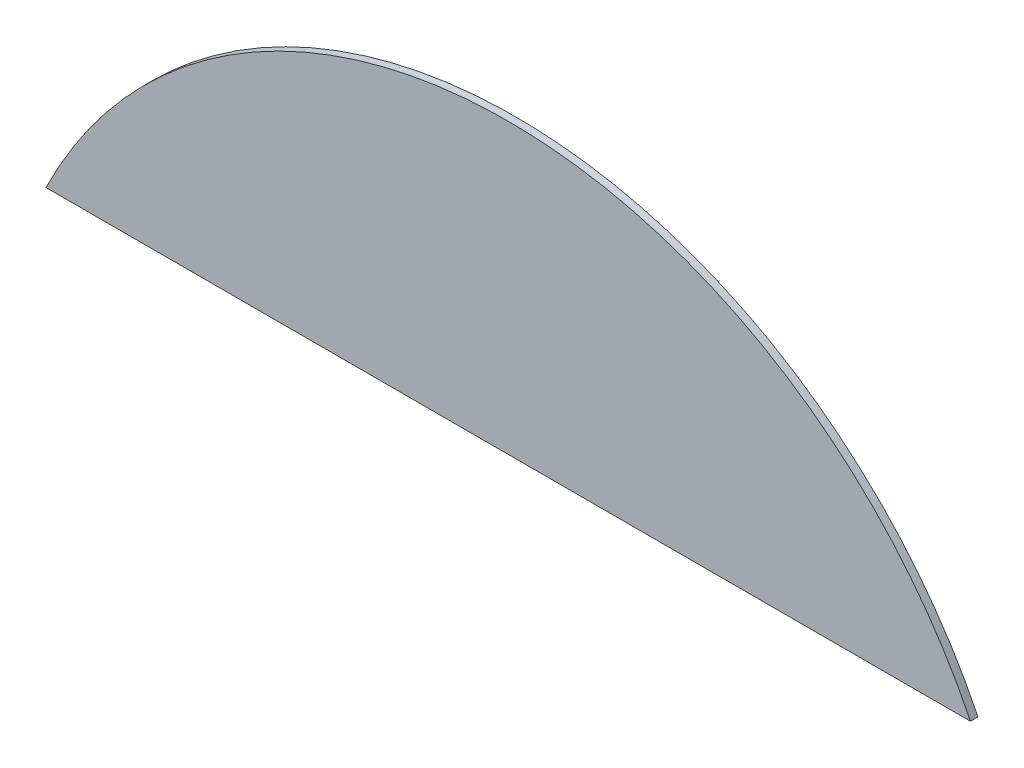
ISO-10303-21;
HEADER;
FILE_DESCRIPTION(('STEP AP214'),'2;1');
FILE_NAME('part.step','',(''),(''),'','','');
FILE_SCHEMA(('AUTOMOTIVE_DESIGN { 1 0 10303 214 1 1 1 1 }'));
ENDSEC;
DATA;
#1=APPLICATION_CONTEXT('core data for automotive mechanical design processes');
#2=APPLICATION_PROTOCOL_DEFINITION('international standard','automotive_design',2000,#1);
#3=PRODUCT_CONTEXT('',#1,'mechanical');
#4=PRODUCT('Part','Part','',(#3));
#5=PRODUCT_RELATED_PRODUCT_CATEGORY('part','',(#4));
#6=PRODUCT_DEFINITION_FORMATION('','',#4);
#7=PRODUCT_DEFINITION_CONTEXT('part definition',#1,'design');
#8=PRODUCT_DEFINITION('design','',#6,#7);
#9=PRODUCT_DEFINITION_SHAPE('','',#8);
#10=(LENGTH_UNIT() NAMED_UNIT(*) SI_UNIT(.MILLI.,.METRE.));
#11=(NAMED_UNIT(*) PLANE_ANGLE_UNIT() SI_UNIT($,.RADIAN.));
#12=(NAMED_UNIT(*) SI_UNIT($,.STERADIAN.) SOLID_ANGLE_UNIT());
#13=UNCERTAINTY_MEASURE_WITH_UNIT(LENGTH_MEASURE(1.E-05),#10,'distance_accuracy_value','');
#14=(GEOMETRIC_REPRESENTATION_CONTEXT(3) GLOBAL_UNCERTAINTY_ASSIGNED_CONTEXT((#13)) GLOBAL_UNIT_ASSIGNED_CONTEXT((#10,
#11,#12)) REPRESENTATION_CONTEXT('',''));
#15=CARTESIAN_POINT('',(0.,0.,0.));
#16=DIRECTION('',(0.,0.,1.));
#17=DIRECTION('',(1.,0.,0.));
#18=AXIS2_PLACEMENT_3D('',#15,#16,#17);
#19=CARTESIAN_POINT('',(0.,90.,3.));
#20=DIRECTION('',(0.,1.,0.));
#21=DIRECTION('',(0.,0.,1.));
#22=AXIS2_PLACEMENT_3D('',#19,#20,#21);
#23=PLANE('',#22);
#24=DIRECTION('',(1.,0.,0.));
#25=VECTOR('',#24,1.);
#26=CARTESIAN_POINT('',(0.,90.,0.));
#27=LINE('',#26,#25);
#28=CARTESIAN_POINT('',(-184.187404563939,90.,0.));
#29=VERTEX_POINT('',#28);
#30=CARTESIAN_POINT('',(184.187404563939,90.,0.));
#31=VERTEX_POINT('',#30);
#32=EDGE_CURVE('E70',#29,#31,#27,.T.);
#33=ORIENTED_EDGE('',*,*,#32,.T.);
#34=DIRECTION('',(0.,0.,-1.));
#35=VECTOR('',#34,1.);
#36=CARTESIAN_POINT('',(184.187404563939,90.,3.));
#37=LINE('',#36,#35);
#38=CARTESIAN_POINT('',(184.187404563939,90.,3.));
#39=VERTEX_POINT('',#38);
#40=EDGE_CURVE('E11',#39,#31,#37,.T.);
#41=ORIENTED_EDGE('',*,*,#40,.F.);
#42=DIRECTION('',(1.,0.,0.));
#43=VECTOR('',#42,1.);
#44=CARTESIAN_POINT('',(0.,90.,3.));
#45=LINE('',#44,#43);
#46=CARTESIAN_POINT('',(-184.187404563939,90.,3.));
#47=VERTEX_POINT('',#46);
#48=EDGE_CURVE('E69',#47,#39,#45,.T.);
#49=ORIENTED_EDGE('',*,*,#48,.F.);
#50=DIRECTION('',(0.,0.,-1.));
#51=VECTOR('',#50,1.);
#52=CARTESIAN_POINT('',(-184.187404563939,90.,3.));
#53=LINE('',#52,#51);
#54=EDGE_CURVE('E47',#47,#29,#53,.T.);
#55=ORIENTED_EDGE('',*,*,#54,.T.);
#56=EDGE_LOOP('',(#33,#41,#49,#55));
#57=FACE_BOUND('',#56,.T.);
#58=ADVANCED_FACE('F39',(#57),#23,.F.);
#59=CARTESIAN_POINT('',(0.,0.,3.));
#60=DIRECTION('',(0.,0.,-1.));
#61=DIRECTION('',(-1.,0.,0.));
#62=AXIS2_PLACEMENT_3D('',#59,#60,#61);
#63=CYLINDRICAL_SURFACE('',#62,205.);
#64=CARTESIAN_POINT('',(0.,0.,0.));
#65=DIRECTION('',(0.,0.,1.));
#66=DIRECTION('',(1.,0.,0.));
#67=AXIS2_PLACEMENT_3D('',#64,#65,#66);
#68=CIRCLE('',#67,205.);
#69=EDGE_CURVE('E62',#31,#29,#68,.T.);
#70=ORIENTED_EDGE('',*,*,#69,.T.);
#71=ORIENTED_EDGE('',*,*,#54,.F.);
#72=CARTESIAN_POINT('',(0.,0.,3.));
#73=DIRECTION('',(0.,0.,1.));
#74=DIRECTION('',(1.,0.,0.));
#75=AXIS2_PLACEMENT_3D('',#72,#73,#74);
#76=CIRCLE('',#75,205.);
#77=EDGE_CURVE('E54',#39,#47,#76,.T.);
#78=ORIENTED_EDGE('',*,*,#77,.F.);
#79=ORIENTED_EDGE('',*,*,#40,.T.);
#80=EDGE_LOOP('',(#70,#71,#78,#79));
#81=FACE_BOUND('',#80,.T.);
#82=ADVANCED_FACE('F65',(#81),#63,.T.);
#83=CARTESIAN_POINT('',(0.,0.,3.));
#84=DIRECTION('',(0.,0.,1.));
#85=DIRECTION('',(1.,0.,0.));
#86=AXIS2_PLACEMENT_3D('',#83,#84,#85);
#87=PLANE('',#86);
#88=ORIENTED_EDGE('',*,*,#48,.T.);
#89=ORIENTED_EDGE('',*,*,#77,.T.);
#90=EDGE_LOOP('',(#88,#89));
#91=FACE_BOUND('',#90,.T.);
#92=ADVANCED_FACE('F77',(#91),#87,.T.);
#93=CARTESIAN_POINT('',(0.,0.,0.));
#94=DIRECTION('',(0.,0.,1.));
#95=DIRECTION('',(1.,0.,0.));
#96=AXIS2_PLACEMENT_3D('',#93,#94,#95);
#97=PLANE('',#96);
#98=ORIENTED_EDGE('',*,*,#32,.F.);
#99=ORIENTED_EDGE('',*,*,#69,.F.);
#100=EDGE_LOOP('',(#98,#99));
#101=FACE_BOUND('',#100,.T.);
#102=ADVANCED_FACE('F73',(#101),#97,.F.);
#103=CLOSED_SHELL('',(#58,#82,#92,#102));
#104=MANIFOLD_SOLID_BREP('B2',#103);
#105=ADVANCED_BREP_SHAPE_REPRESENTATION('',(#18,#104),#14);
#106=SHAPE_DEFINITION_REPRESENTATION(#9,#105);
ENDSEC;
END-ISO-10303-21;
